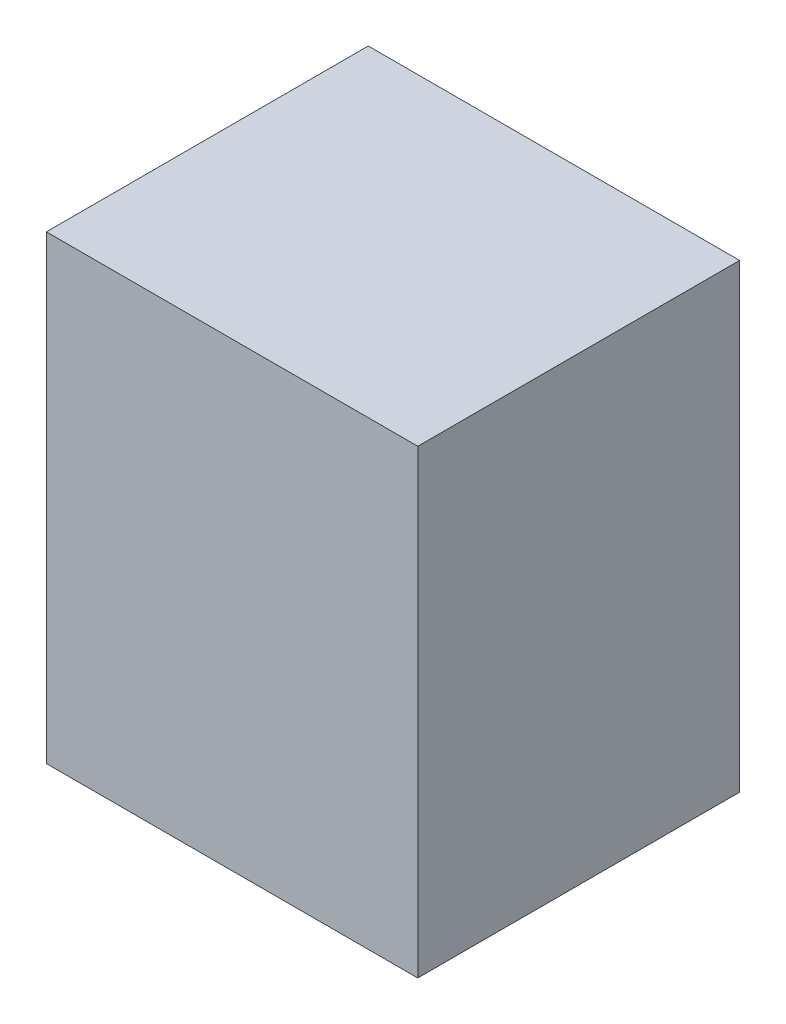
ISO-10303-21;
HEADER;
FILE_DESCRIPTION(('STEP AP214'),'2;1');
FILE_NAME('part.step','',(''),(''),'','','');
FILE_SCHEMA(('AUTOMOTIVE_DESIGN { 1 0 10303 214 1 1 1 1 }'));
ENDSEC;
DATA;
#1=APPLICATION_CONTEXT('core data for automotive mechanical design processes');
#2=APPLICATION_PROTOCOL_DEFINITION('international standard','automotive_design',2000,#1);
#3=PRODUCT_CONTEXT('',#1,'mechanical');
#4=PRODUCT('Part','Part','',(#3));
#5=PRODUCT_RELATED_PRODUCT_CATEGORY('part','',(#4));
#6=PRODUCT_DEFINITION_FORMATION('','',#4);
#7=PRODUCT_DEFINITION_CONTEXT('part definition',#1,'design');
#8=PRODUCT_DEFINITION('design','',#6,#7);
#9=PRODUCT_DEFINITION_SHAPE('','',#8);
#10=(LENGTH_UNIT() NAMED_UNIT(*) SI_UNIT(.MILLI.,.METRE.));
#11=(NAMED_UNIT(*) PLANE_ANGLE_UNIT() SI_UNIT($,.RADIAN.));
#12=(NAMED_UNIT(*) SI_UNIT($,.STERADIAN.) SOLID_ANGLE_UNIT());
#13=UNCERTAINTY_MEASURE_WITH_UNIT(LENGTH_MEASURE(1.E-05),#10,'distance_accuracy_value','');
#14=(GEOMETRIC_REPRESENTATION_CONTEXT(3) GLOBAL_UNCERTAINTY_ASSIGNED_CONTEXT((#13)) GLOBAL_UNIT_ASSIGNED_CONTEXT((#10,
#11,#12)) REPRESENTATION_CONTEXT('',''));
#15=CARTESIAN_POINT('',(0.,0.,0.));
#16=DIRECTION('',(0.,0.,1.));
#17=DIRECTION('',(1.,0.,0.));
#18=AXIS2_PLACEMENT_3D('',#15,#16,#17);
#19=CARTESIAN_POINT('',(37.5,93.,32.5));
#20=DIRECTION('',(-1.,0.,0.));
#21=DIRECTION('',(0.,0.,1.));
#22=AXIS2_PLACEMENT_3D('',#19,#20,#21);
#23=PLANE('',#22);
#24=DIRECTION('',(0.,0.,-1.));
#25=VECTOR('',#24,1.);
#26=CARTESIAN_POINT('',(37.5,0.,32.5));
#27=LINE('',#26,#25);
#28=CARTESIAN_POINT('',(37.5,0.,32.5));
#29=VERTEX_POINT('',#28);
#30=CARTESIAN_POINT('',(37.5,0.,-32.5));
#31=VERTEX_POINT('',#30);
#32=EDGE_CURVE('E102',#29,#31,#27,.T.);
#33=ORIENTED_EDGE('',*,*,#32,.T.);
#34=DIRECTION('',(0.,-1.,0.));
#35=VECTOR('',#34,1.);
#36=CARTESIAN_POINT('',(37.5,93.,-32.5));
#37=LINE('',#36,#35);
#38=CARTESIAN_POINT('',(37.5,93.,-32.5));
#39=VERTEX_POINT('',#38);
#40=EDGE_CURVE('E11',#39,#31,#37,.T.);
#41=ORIENTED_EDGE('',*,*,#40,.F.);
#42=DIRECTION('',(0.,0.,-1.));
#43=VECTOR('',#42,1.);
#44=CARTESIAN_POINT('',(37.5,93.,32.5));
#45=LINE('',#44,#43);
#46=CARTESIAN_POINT('',(37.5,93.,32.5));
#47=VERTEX_POINT('',#46);
#48=EDGE_CURVE('E90',#47,#39,#45,.T.);
#49=ORIENTED_EDGE('',*,*,#48,.F.);
#50=DIRECTION('',(0.,-1.,0.));
#51=VECTOR('',#50,1.);
#52=CARTESIAN_POINT('',(37.5,93.,32.5));
#53=LINE('',#52,#51);
#54=EDGE_CURVE('E98',#47,#29,#53,.T.);
#55=ORIENTED_EDGE('',*,*,#54,.T.);
#56=EDGE_LOOP('',(#33,#41,#49,#55));
#57=FACE_BOUND('',#56,.T.);
#58=ADVANCED_FACE('F39',(#57),#23,.F.);
#59=CARTESIAN_POINT('',(-37.5,93.,-32.5));
#60=DIRECTION('',(0.,0.,1.));
#61=DIRECTION('',(1.,0.,0.));
#62=AXIS2_PLACEMENT_3D('',#59,#60,#61);
#63=PLANE('',#62);
#64=DIRECTION('',(-1.,0.,0.));
#65=VECTOR('',#64,1.);
#66=CARTESIAN_POINT('',(-37.5,0.,-32.5));
#67=LINE('',#66,#65);
#68=CARTESIAN_POINT('',(-37.5,0.,-32.5));
#69=VERTEX_POINT('',#68);
#70=EDGE_CURVE('E94',#31,#69,#67,.T.);
#71=ORIENTED_EDGE('',*,*,#70,.T.);
#72=DIRECTION('',(0.,-1.,0.));
#73=VECTOR('',#72,1.);
#74=CARTESIAN_POINT('',(-37.5,93.,-32.5));
#75=LINE('',#74,#73);
#76=CARTESIAN_POINT('',(-37.5,93.,-32.5));
#77=VERTEX_POINT('',#76);
#78=EDGE_CURVE('E47',#77,#69,#75,.T.);
#79=ORIENTED_EDGE('',*,*,#78,.F.);
#80=DIRECTION('',(-1.,0.,0.));
#81=VECTOR('',#80,1.);
#82=CARTESIAN_POINT('',(-37.5,93.,-32.5));
#83=LINE('',#82,#81);
#84=EDGE_CURVE('E85',#39,#77,#83,.T.);
#85=ORIENTED_EDGE('',*,*,#84,.F.);
#86=ORIENTED_EDGE('',*,*,#40,.T.);
#87=EDGE_LOOP('',(#71,#79,#85,#86));
#88=FACE_BOUND('',#87,.T.);
#89=ADVANCED_FACE('F93',(#88),#63,.F.);
#90=CARTESIAN_POINT('',(-37.5,93.,32.5));
#91=DIRECTION('',(1.,0.,0.));
#92=DIRECTION('',(0.,0.,-1.));
#93=AXIS2_PLACEMENT_3D('',#90,#91,#92);
#94=PLANE('',#93);
#95=DIRECTION('',(0.,0.,1.));
#96=VECTOR('',#95,1.);
#97=CARTESIAN_POINT('',(-37.5,0.,32.5));
#98=LINE('',#97,#96);
#99=CARTESIAN_POINT('',(-37.5,0.,32.5));
#100=VERTEX_POINT('',#99);
#101=EDGE_CURVE('E72',#69,#100,#98,.T.);
#102=ORIENTED_EDGE('',*,*,#101,.T.);
#103=DIRECTION('',(0.,-1.,0.));
#104=VECTOR('',#103,1.);
#105=CARTESIAN_POINT('',(-37.5,93.,32.5));
#106=LINE('',#105,#104);
#107=CARTESIAN_POINT('',(-37.5,93.,32.5));
#108=VERTEX_POINT('',#107);
#109=EDGE_CURVE('E95',#108,#100,#106,.T.);
#110=ORIENTED_EDGE('',*,*,#109,.F.);
#111=DIRECTION('',(0.,0.,1.));
#112=VECTOR('',#111,1.);
#113=CARTESIAN_POINT('',(-37.5,93.,32.5));
#114=LINE('',#113,#112);
#115=EDGE_CURVE('E88',#77,#108,#114,.T.);
#116=ORIENTED_EDGE('',*,*,#115,.F.);
#117=ORIENTED_EDGE('',*,*,#78,.T.);
#118=EDGE_LOOP('',(#102,#110,#116,#117));
#119=FACE_BOUND('',#118,.T.);
#120=ADVANCED_FACE('F96',(#119),#94,.F.);
#121=CARTESIAN_POINT('',(-37.5,93.,32.5));
#122=DIRECTION('',(0.,0.,-1.));
#123=DIRECTION('',(-1.,0.,0.));
#124=AXIS2_PLACEMENT_3D('',#121,#122,#123);
#125=PLANE('',#124);
#126=DIRECTION('',(1.,0.,0.));
#127=VECTOR('',#126,1.);
#128=CARTESIAN_POINT('',(-37.5,0.,32.5));
#129=LINE('',#128,#127);
#130=EDGE_CURVE('E78',#100,#29,#129,.T.);
#131=ORIENTED_EDGE('',*,*,#130,.T.);
#132=ORIENTED_EDGE('',*,*,#54,.F.);
#133=DIRECTION('',(1.,0.,0.));
#134=VECTOR('',#133,1.);
#135=CARTESIAN_POINT('',(-37.5,93.,32.5));
#136=LINE('',#135,#134);
#137=EDGE_CURVE('E55',#108,#47,#136,.T.);
#138=ORIENTED_EDGE('',*,*,#137,.F.);
#139=ORIENTED_EDGE('',*,*,#109,.T.);
#140=EDGE_LOOP('',(#131,#132,#138,#139));
#141=FACE_BOUND('',#140,.T.);
#142=ADVANCED_FACE('F109',(#141),#125,.F.);
#143=CARTESIAN_POINT('',(0.,93.,0.));
#144=DIRECTION('',(0.,-1.,0.));
#145=DIRECTION('',(0.,0.,-1.));
#146=AXIS2_PLACEMENT_3D('',#143,#144,#145);
#147=PLANE('',#146);
#148=ORIENTED_EDGE('',*,*,#48,.T.);
#149=ORIENTED_EDGE('',*,*,#84,.T.);
#150=ORIENTED_EDGE('',*,*,#115,.T.);
#151=ORIENTED_EDGE('',*,*,#137,.T.);
#152=EDGE_LOOP('',(#148,#149,#150,#151));
#153=FACE_BOUND('',#152,.T.);
#154=ADVANCED_FACE('F86',(#153),#147,.F.);
#155=CARTESIAN_POINT('',(0.,0.,0.));
#156=DIRECTION('',(0.,-1.,0.));
#157=DIRECTION('',(0.,0.,-1.));
#158=AXIS2_PLACEMENT_3D('',#155,#156,#157);
#159=PLANE('',#158);
#160=ORIENTED_EDGE('',*,*,#32,.F.);
#161=ORIENTED_EDGE('',*,*,#130,.F.);
#162=ORIENTED_EDGE('',*,*,#101,.F.);
#163=ORIENTED_EDGE('',*,*,#70,.F.);
#164=EDGE_LOOP('',(#160,#161,#162,#163));
#165=FACE_BOUND('',#164,.T.);
#166=ADVANCED_FACE('F112',(#165),#159,.T.);
#167=CLOSED_SHELL('',(#58,#89,#120,#142,#154,#166));
#168=MANIFOLD_SOLID_BREP('B2',#167);
#169=ADVANCED_BREP_SHAPE_REPRESENTATION('',(#18,#168),#14);
#170=SHAPE_DEFINITION_REPRESENTATION(#9,#169);
ENDSEC;
END-ISO-10303-21;
